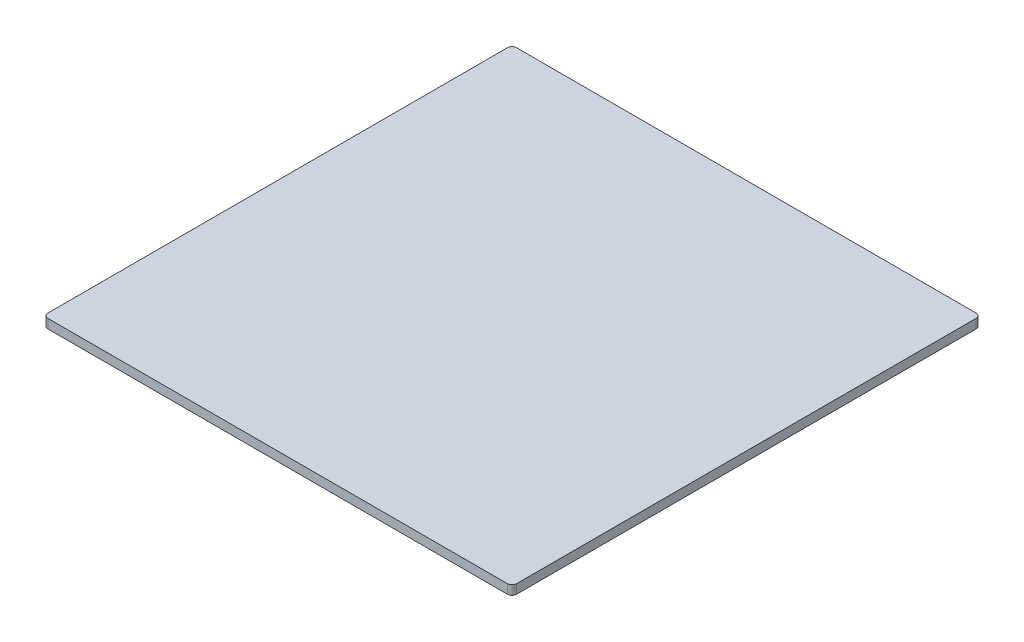
ISO-10303-21;
HEADER;
FILE_DESCRIPTION(('STEP AP214'),'2;1');
FILE_NAME('part.step','',(''),(''),'','','');
FILE_SCHEMA(('AUTOMOTIVE_DESIGN { 1 0 10303 214 1 1 1 1 }'));
ENDSEC;
DATA;
#1=APPLICATION_CONTEXT('core data for automotive mechanical design processes');
#2=APPLICATION_PROTOCOL_DEFINITION('international standard','automotive_design',2000,#1);
#3=PRODUCT_CONTEXT('',#1,'mechanical');
#4=PRODUCT('Part','Part','',(#3));
#5=PRODUCT_RELATED_PRODUCT_CATEGORY('part','',(#4));
#6=PRODUCT_DEFINITION_FORMATION('','',#4);
#7=PRODUCT_DEFINITION_CONTEXT('part definition',#1,'design');
#8=PRODUCT_DEFINITION('design','',#6,#7);
#9=PRODUCT_DEFINITION_SHAPE('','',#8);
#10=(LENGTH_UNIT() NAMED_UNIT(*) SI_UNIT(.MILLI.,.METRE.));
#11=(NAMED_UNIT(*) PLANE_ANGLE_UNIT() SI_UNIT($,.RADIAN.));
#12=(NAMED_UNIT(*) SI_UNIT($,.STERADIAN.) SOLID_ANGLE_UNIT());
#13=UNCERTAINTY_MEASURE_WITH_UNIT(LENGTH_MEASURE(1.E-05),#10,'distance_accuracy_value','');
#14=(GEOMETRIC_REPRESENTATION_CONTEXT(3) GLOBAL_UNCERTAINTY_ASSIGNED_CONTEXT((#13)) GLOBAL_UNIT_ASSIGNED_CONTEXT((#10,
#11,#12)) REPRESENTATION_CONTEXT('',''));
#15=CARTESIAN_POINT('',(0.,0.,0.));
#16=DIRECTION('',(0.,0.,1.));
#17=DIRECTION('',(1.,0.,0.));
#18=AXIS2_PLACEMENT_3D('',#15,#16,#17);
#19=CARTESIAN_POINT('',(73.2971919569936,2.,-159.616125956132));
#20=DIRECTION('',(0.,-1.,0.));
#21=DIRECTION('',(0.,0.,-1.));
#22=AXIS2_PLACEMENT_3D('',#19,#20,#21);
#23=CYLINDRICAL_SURFACE('',#22,1.);
#24=CARTESIAN_POINT('',(73.2971919569936,0.,-159.616125956132));
#25=DIRECTION('',(0.,1.,0.));
#26=DIRECTION('',(0.,0.,-1.));
#27=AXIS2_PLACEMENT_3D('',#24,#25,#26);
#28=CIRCLE('',#27,1.);
#29=CARTESIAN_POINT('',(74.2971919569936,0.,-159.616125956132));
#30=VERTEX_POINT('',#29);
#31=CARTESIAN_POINT('',(73.2971919569936,0.,-160.616125956132));
#32=VERTEX_POINT('',#31);
#33=EDGE_CURVE('E129',#30,#32,#28,.T.);
#34=ORIENTED_EDGE('',*,*,#33,.T.);
#35=DIRECTION('',(0.,-1.,0.));
#36=VECTOR('',#35,1.);
#37=CARTESIAN_POINT('',(73.2971919569936,2.,-160.616125956132));
#38=LINE('',#37,#36);
#39=CARTESIAN_POINT('',(73.2971919569936,2.,-160.616125956132));
#40=VERTEX_POINT('',#39);
#41=EDGE_CURVE('E11',#40,#32,#38,.T.);
#42=ORIENTED_EDGE('',*,*,#41,.F.);
#43=CARTESIAN_POINT('',(73.2971919569936,2.,-159.616125956132));
#44=DIRECTION('',(0.,1.,0.));
#45=DIRECTION('',(0.,0.,-1.));
#46=AXIS2_PLACEMENT_3D('',#43,#44,#45);
#47=CIRCLE('',#46,1.);
#48=CARTESIAN_POINT('',(74.2971919569936,2.,-159.616125956132));
#49=VERTEX_POINT('',#48);
#50=EDGE_CURVE('E143',#49,#40,#47,.T.);
#51=ORIENTED_EDGE('',*,*,#50,.F.);
#52=DIRECTION('',(0.,-1.,0.));
#53=VECTOR('',#52,1.);
#54=CARTESIAN_POINT('',(74.2971919569936,2.,-159.616125956132));
#55=LINE('',#54,#53);
#56=EDGE_CURVE('E125',#49,#30,#55,.T.);
#57=ORIENTED_EDGE('',*,*,#56,.T.);
#58=EDGE_LOOP('',(#34,#42,#51,#57));
#59=FACE_BOUND('',#58,.T.);
#60=ADVANCED_FACE('F33',(#59),#23,.T.);
#61=CARTESIAN_POINT('',(-26.7028080430064,2.,-160.616125956132));
#62=DIRECTION('',(0.,0.,1.));
#63=DIRECTION('',(1.,0.,0.));
#64=AXIS2_PLACEMENT_3D('',#61,#62,#63);
#65=PLANE('',#64);
#66=DIRECTION('',(-1.,0.,0.));
#67=VECTOR('',#66,1.);
#68=CARTESIAN_POINT('',(-26.7028080430064,0.,-160.616125956132));
#69=LINE('',#68,#67);
#70=CARTESIAN_POINT('',(-26.7028080430064,0.,-160.616125956132));
#71=VERTEX_POINT('',#70);
#72=EDGE_CURVE('E132',#32,#71,#69,.T.);
#73=ORIENTED_EDGE('',*,*,#72,.T.);
#74=DIRECTION('',(0.,-1.,0.));
#75=VECTOR('',#74,1.);
#76=CARTESIAN_POINT('',(-26.7028080430064,2.,-160.616125956132));
#77=LINE('',#76,#75);
#78=CARTESIAN_POINT('',(-26.7028080430064,2.,-160.616125956132));
#79=VERTEX_POINT('',#78);
#80=EDGE_CURVE('E41',#79,#71,#77,.T.);
#81=ORIENTED_EDGE('',*,*,#80,.F.);
#82=DIRECTION('',(-1.,0.,0.));
#83=VECTOR('',#82,1.);
#84=CARTESIAN_POINT('',(-26.7028080430064,2.,-160.616125956132));
#85=LINE('',#84,#83);
#86=EDGE_CURVE('E92',#40,#79,#85,.T.);
#87=ORIENTED_EDGE('',*,*,#86,.F.);
#88=ORIENTED_EDGE('',*,*,#41,.T.);
#89=EDGE_LOOP('',(#73,#81,#87,#88));
#90=FACE_BOUND('',#89,.T.);
#91=ADVANCED_FACE('F178',(#90),#65,.F.);
#92=CARTESIAN_POINT('',(-26.7028080430064,2.,-159.616125956132));
#93=DIRECTION('',(0.,-1.,0.));
#94=DIRECTION('',(0.,0.,-1.));
#95=AXIS2_PLACEMENT_3D('',#92,#93,#94);
#96=CYLINDRICAL_SURFACE('',#95,0.999999999999999);
#97=CARTESIAN_POINT('',(-26.7028080430064,0.,-159.616125956132));
#98=DIRECTION('',(0.,1.,0.));
#99=DIRECTION('',(0.,0.,1.));
#100=AXIS2_PLACEMENT_3D('',#97,#98,#99);
#101=CIRCLE('',#100,0.999999999999999);
#102=CARTESIAN_POINT('',(-27.7028080430064,0.,-159.616125956132));
#103=VERTEX_POINT('',#102);
#104=EDGE_CURVE('E134',#71,#103,#101,.T.);
#105=ORIENTED_EDGE('',*,*,#104,.T.);
#106=DIRECTION('',(0.,-1.,0.));
#107=VECTOR('',#106,1.);
#108=CARTESIAN_POINT('',(-27.7028080430064,2.,-159.616125956132));
#109=LINE('',#108,#107);
#110=CARTESIAN_POINT('',(-27.7028080430064,2.,-159.616125956132));
#111=VERTEX_POINT('',#110);
#112=EDGE_CURVE('E150',#111,#103,#109,.T.);
#113=ORIENTED_EDGE('',*,*,#112,.F.);
#114=CARTESIAN_POINT('',(-26.7028080430064,2.,-159.616125956132));
#115=DIRECTION('',(0.,1.,0.));
#116=DIRECTION('',(0.,0.,1.));
#117=AXIS2_PLACEMENT_3D('',#114,#115,#116);
#118=CIRCLE('',#117,0.999999999999999);
#119=EDGE_CURVE('E158',#79,#111,#118,.T.);
#120=ORIENTED_EDGE('',*,*,#119,.F.);
#121=ORIENTED_EDGE('',*,*,#80,.T.);
#122=EDGE_LOOP('',(#105,#113,#120,#121));
#123=FACE_BOUND('',#122,.T.);
#124=ADVANCED_FACE('F156',(#123),#96,.T.);
#125=CARTESIAN_POINT('',(-27.7028080430064,2.,-159.616125956132));
#126=DIRECTION('',(1.,0.,0.));
#127=DIRECTION('',(0.,0.,-1.));
#128=AXIS2_PLACEMENT_3D('',#125,#126,#127);
#129=PLANE('',#128);
#130=DIRECTION('',(0.,0.,1.));
#131=VECTOR('',#130,1.);
#132=CARTESIAN_POINT('',(-27.7028080430064,0.,-159.616125956132));
#133=LINE('',#132,#131);
#134=CARTESIAN_POINT('',(-27.7028080430064,0.,-59.6161259561315));
#135=VERTEX_POINT('',#134);
#136=EDGE_CURVE('E136',#103,#135,#133,.T.);
#137=ORIENTED_EDGE('',*,*,#136,.T.);
#138=DIRECTION('',(0.,-1.,0.));
#139=VECTOR('',#138,1.);
#140=CARTESIAN_POINT('',(-27.7028080430064,2.,-59.6161259561315));
#141=LINE('',#140,#139);
#142=CARTESIAN_POINT('',(-27.7028080430064,2.,-59.6161259561315));
#143=VERTEX_POINT('',#142);
#144=EDGE_CURVE('E147',#143,#135,#141,.T.);
#145=ORIENTED_EDGE('',*,*,#144,.F.);
#146=DIRECTION('',(0.,0.,1.));
#147=VECTOR('',#146,1.);
#148=CARTESIAN_POINT('',(-27.7028080430064,2.,-159.616125956132));
#149=LINE('',#148,#147);
#150=EDGE_CURVE('E170',#111,#143,#149,.T.);
#151=ORIENTED_EDGE('',*,*,#150,.F.);
#152=ORIENTED_EDGE('',*,*,#112,.T.);
#153=EDGE_LOOP('',(#137,#145,#151,#152));
#154=FACE_BOUND('',#153,.T.);
#155=ADVANCED_FACE('F166',(#154),#129,.F.);
#156=CARTESIAN_POINT('',(-26.7028080430064,2.,-59.6161259561315));
#157=DIRECTION('',(0.,-1.,0.));
#158=DIRECTION('',(0.,0.,-1.));
#159=AXIS2_PLACEMENT_3D('',#156,#157,#158);
#160=CYLINDRICAL_SURFACE('',#159,1.);
#161=CARTESIAN_POINT('',(-26.7028080430064,0.,-59.6161259561315));
#162=DIRECTION('',(0.,1.,0.));
#163=DIRECTION('',(0.,0.,1.));
#164=AXIS2_PLACEMENT_3D('',#161,#162,#163);
#165=CIRCLE('',#164,1.);
#166=CARTESIAN_POINT('',(-26.7028080430064,0.,-58.6161259561315));
#167=VERTEX_POINT('',#166);
#168=EDGE_CURVE('E138',#135,#167,#165,.T.);
#169=ORIENTED_EDGE('',*,*,#168,.T.);
#170=DIRECTION('',(0.,-1.,0.));
#171=VECTOR('',#170,1.);
#172=CARTESIAN_POINT('',(-26.7028080430064,2.,-58.6161259561315));
#173=LINE('',#172,#171);
#174=CARTESIAN_POINT('',(-26.7028080430064,2.,-58.6161259561315));
#175=VERTEX_POINT('',#174);
#176=EDGE_CURVE('E120',#175,#167,#173,.T.);
#177=ORIENTED_EDGE('',*,*,#176,.F.);
#178=CARTESIAN_POINT('',(-26.7028080430064,2.,-59.6161259561315));
#179=DIRECTION('',(0.,1.,0.));
#180=DIRECTION('',(0.,0.,1.));
#181=AXIS2_PLACEMENT_3D('',#178,#179,#180);
#182=CIRCLE('',#181,1.);
#183=EDGE_CURVE('E111',#143,#175,#182,.T.);
#184=ORIENTED_EDGE('',*,*,#183,.F.);
#185=ORIENTED_EDGE('',*,*,#144,.T.);
#186=EDGE_LOOP('',(#169,#177,#184,#185));
#187=FACE_BOUND('',#186,.T.);
#188=ADVANCED_FACE('F169',(#187),#160,.T.);
#189=CARTESIAN_POINT('',(-26.7028080430064,2.,-58.6161259561315));
#190=DIRECTION('',(0.,0.,-1.));
#191=DIRECTION('',(-1.,0.,0.));
#192=AXIS2_PLACEMENT_3D('',#189,#190,#191);
#193=PLANE('',#192);
#194=DIRECTION('',(1.,0.,0.));
#195=VECTOR('',#194,1.);
#196=CARTESIAN_POINT('',(-26.7028080430064,0.,-58.6161259561315));
#197=LINE('',#196,#195);
#198=CARTESIAN_POINT('',(73.2971919569936,0.,-58.6161259561315));
#199=VERTEX_POINT('',#198);
#200=EDGE_CURVE('E119',#167,#199,#197,.T.);
#201=ORIENTED_EDGE('',*,*,#200,.T.);
#202=DIRECTION('',(0.,-1.,0.));
#203=VECTOR('',#202,1.);
#204=CARTESIAN_POINT('',(73.2971919569936,2.,-58.6161259561315));
#205=LINE('',#204,#203);
#206=CARTESIAN_POINT('',(73.2971919569936,2.,-58.6161259561315));
#207=VERTEX_POINT('',#206);
#208=EDGE_CURVE('E116',#207,#199,#205,.T.);
#209=ORIENTED_EDGE('',*,*,#208,.F.);
#210=DIRECTION('',(1.,0.,0.));
#211=VECTOR('',#210,1.);
#212=CARTESIAN_POINT('',(-26.7028080430064,2.,-58.6161259561315));
#213=LINE('',#212,#211);
#214=EDGE_CURVE('E105',#175,#207,#213,.T.);
#215=ORIENTED_EDGE('',*,*,#214,.F.);
#216=ORIENTED_EDGE('',*,*,#176,.T.);
#217=EDGE_LOOP('',(#201,#209,#215,#216));
#218=FACE_BOUND('',#217,.T.);
#219=ADVANCED_FACE('F117',(#218),#193,.F.);
#220=CARTESIAN_POINT('',(73.2971919569936,2.,-59.6161259561315));
#221=DIRECTION('',(0.,-1.,0.));
#222=DIRECTION('',(0.,0.,-1.));
#223=AXIS2_PLACEMENT_3D('',#220,#221,#222);
#224=CYLINDRICAL_SURFACE('',#223,1.);
#225=CARTESIAN_POINT('',(73.2971919569936,0.,-59.6161259561315));
#226=DIRECTION('',(0.,1.,0.));
#227=DIRECTION('',(0.,0.,1.));
#228=AXIS2_PLACEMENT_3D('',#225,#226,#227);
#229=CIRCLE('',#228,1.);
#230=CARTESIAN_POINT('',(74.2971919569936,0.,-59.6161259561315));
#231=VERTEX_POINT('',#230);
#232=EDGE_CURVE('E78',#199,#231,#229,.T.);
#233=ORIENTED_EDGE('',*,*,#232,.T.);
#234=DIRECTION('',(0.,-1.,0.));
#235=VECTOR('',#234,1.);
#236=CARTESIAN_POINT('',(74.2971919569936,2.,-59.6161259561315));
#237=LINE('',#236,#235);
#238=CARTESIAN_POINT('',(74.2971919569936,2.,-59.6161259561315));
#239=VERTEX_POINT('',#238);
#240=EDGE_CURVE('E121',#239,#231,#237,.T.);
#241=ORIENTED_EDGE('',*,*,#240,.F.);
#242=CARTESIAN_POINT('',(73.2971919569936,2.,-59.6161259561315));
#243=DIRECTION('',(0.,1.,0.));
#244=DIRECTION('',(0.,0.,1.));
#245=AXIS2_PLACEMENT_3D('',#242,#243,#244);
#246=CIRCLE('',#245,1.);
#247=EDGE_CURVE('E109',#207,#239,#246,.T.);
#248=ORIENTED_EDGE('',*,*,#247,.F.);
#249=ORIENTED_EDGE('',*,*,#208,.T.);
#250=EDGE_LOOP('',(#233,#241,#248,#249));
#251=FACE_BOUND('',#250,.T.);
#252=ADVANCED_FACE('F123',(#251),#224,.T.);
#253=CARTESIAN_POINT('',(74.2971919569936,2.,-159.616125956132));
#254=DIRECTION('',(-1.,0.,0.));
#255=DIRECTION('',(0.,0.,1.));
#256=AXIS2_PLACEMENT_3D('',#253,#254,#255);
#257=PLANE('',#256);
#258=DIRECTION('',(0.,0.,-1.));
#259=VECTOR('',#258,1.);
#260=CARTESIAN_POINT('',(74.2971919569936,0.,-159.616125956132));
#261=LINE('',#260,#259);
#262=EDGE_CURVE('E84',#231,#30,#261,.T.);
#263=ORIENTED_EDGE('',*,*,#262,.T.);
#264=ORIENTED_EDGE('',*,*,#56,.F.);
#265=DIRECTION('',(0.,0.,-1.));
#266=VECTOR('',#265,1.);
#267=CARTESIAN_POINT('',(74.2971919569936,2.,-159.616125956132));
#268=LINE('',#267,#266);
#269=EDGE_CURVE('E49',#239,#49,#268,.T.);
#270=ORIENTED_EDGE('',*,*,#269,.F.);
#271=ORIENTED_EDGE('',*,*,#240,.T.);
#272=EDGE_LOOP('',(#263,#264,#270,#271));
#273=FACE_BOUND('',#272,.T.);
#274=ADVANCED_FACE('F194',(#273),#257,.F.);
#275=CARTESIAN_POINT('',(73.2971919569936,2.,-159.616125956132));
#276=DIRECTION('',(0.,-1.,0.));
#277=DIRECTION('',(0.,0.,-1.));
#278=AXIS2_PLACEMENT_3D('',#275,#276,#277);
#279=PLANE('',#278);
#280=ORIENTED_EDGE('',*,*,#50,.T.);
#281=ORIENTED_EDGE('',*,*,#86,.T.);
#282=ORIENTED_EDGE('',*,*,#119,.T.);
#283=ORIENTED_EDGE('',*,*,#150,.T.);
#284=ORIENTED_EDGE('',*,*,#183,.T.);
#285=ORIENTED_EDGE('',*,*,#214,.T.);
#286=ORIENTED_EDGE('',*,*,#247,.T.);
#287=ORIENTED_EDGE('',*,*,#269,.T.);
#288=EDGE_LOOP('',(#280,#281,#282,#283,#284,#285,#286,#287));
#289=FACE_BOUND('',#288,.T.);
#290=ADVANCED_FACE('F107',(#289),#279,.F.);
#291=CARTESIAN_POINT('',(73.2971919569936,0.,-159.616125956132));
#292=DIRECTION('',(0.,-1.,0.));
#293=DIRECTION('',(0.,0.,-1.));
#294=AXIS2_PLACEMENT_3D('',#291,#292,#293);
#295=PLANE('',#294);
#296=ORIENTED_EDGE('',*,*,#33,.F.);
#297=ORIENTED_EDGE('',*,*,#262,.F.);
#298=ORIENTED_EDGE('',*,*,#232,.F.);
#299=ORIENTED_EDGE('',*,*,#200,.F.);
#300=ORIENTED_EDGE('',*,*,#168,.F.);
#301=ORIENTED_EDGE('',*,*,#136,.F.);
#302=ORIENTED_EDGE('',*,*,#104,.F.);
#303=ORIENTED_EDGE('',*,*,#72,.F.);
#304=EDGE_LOOP('',(#296,#297,#298,#299,#300,#301,#302,#303));
#305=FACE_BOUND('',#304,.T.);
#306=ADVANCED_FACE('F162',(#305),#295,.T.);
#307=CLOSED_SHELL('',(#60,#91,#124,#155,#188,#219,#252,#274,#290,#306));
#308=MANIFOLD_SOLID_BREP('B2',#307);
#309=ADVANCED_BREP_SHAPE_REPRESENTATION('',(#18,#308),#14);
#310=SHAPE_DEFINITION_REPRESENTATION(#9,#309);
ENDSEC;
END-ISO-10303-21;
